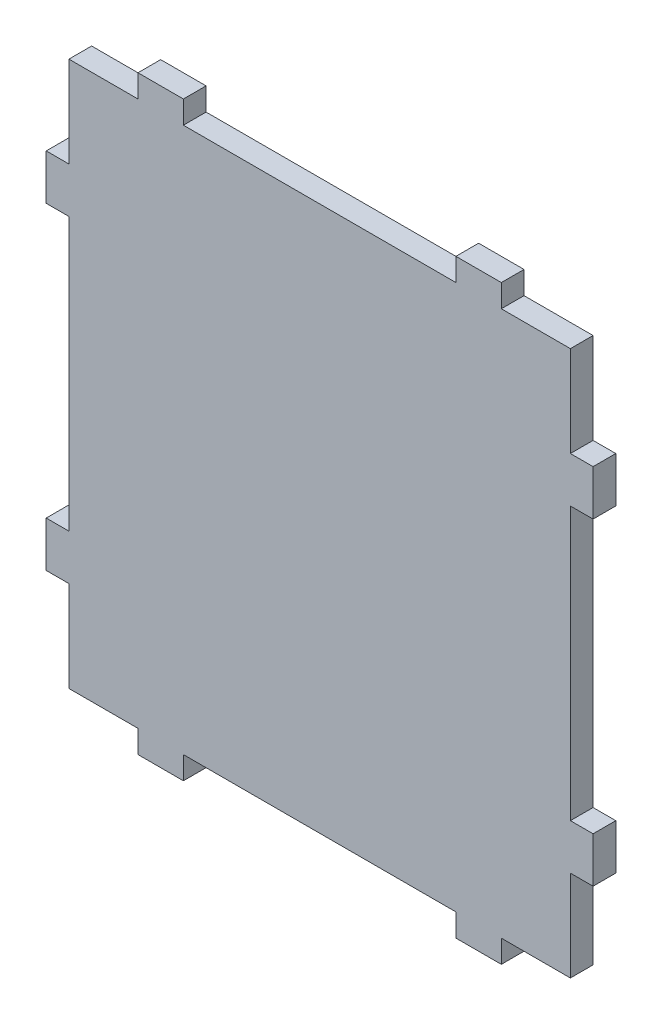
ISO-10303-21;
HEADER;
FILE_DESCRIPTION(('STEP AP214'),'2;1');
FILE_NAME('part.step','',(''),(''),'','','');
FILE_SCHEMA(('AUTOMOTIVE_DESIGN { 1 0 10303 214 1 1 1 1 }'));
ENDSEC;
DATA;
#1=APPLICATION_CONTEXT('core data for automotive mechanical design processes');
#2=APPLICATION_PROTOCOL_DEFINITION('international standard','automotive_design',2000,#1);
#3=PRODUCT_CONTEXT('',#1,'mechanical');
#4=PRODUCT('Part','Part','',(#3));
#5=PRODUCT_RELATED_PRODUCT_CATEGORY('part','',(#4));
#6=PRODUCT_DEFINITION_FORMATION('','',#4);
#7=PRODUCT_DEFINITION_CONTEXT('part definition',#1,'design');
#8=PRODUCT_DEFINITION('design','',#6,#7);
#9=PRODUCT_DEFINITION_SHAPE('','',#8);
#10=(LENGTH_UNIT() NAMED_UNIT(*) SI_UNIT(.MILLI.,.METRE.));
#11=(NAMED_UNIT(*) PLANE_ANGLE_UNIT() SI_UNIT($,.RADIAN.));
#12=(NAMED_UNIT(*) SI_UNIT($,.STERADIAN.) SOLID_ANGLE_UNIT());
#13=UNCERTAINTY_MEASURE_WITH_UNIT(LENGTH_MEASURE(1.E-05),#10,'distance_accuracy_value','');
#14=(GEOMETRIC_REPRESENTATION_CONTEXT(3) GLOBAL_UNCERTAINTY_ASSIGNED_CONTEXT((#13)) GLOBAL_UNIT_ASSIGNED_CONTEXT((#10,
#11,#12)) REPRESENTATION_CONTEXT('',''));
#15=CARTESIAN_POINT('',(0.,0.,0.));
#16=DIRECTION('',(0.,0.,1.));
#17=DIRECTION('',(1.,0.,0.));
#18=AXIS2_PLACEMENT_3D('',#15,#16,#17);
#19=CARTESIAN_POINT('',(-3.175,0.,3.175));
#20=DIRECTION('',(-1.,0.,0.));
#21=DIRECTION('',(0.,0.,1.));
#22=AXIS2_PLACEMENT_3D('',#19,#20,#21);
#23=PLANE('',#22);
#24=DIRECTION('',(0.,1.,0.));
#25=VECTOR('',#24,1.);
#26=CARTESIAN_POINT('',(-3.175,0.,0.));
#27=LINE('',#26,#25);
#28=CARTESIAN_POINT('',(-3.175,-19.05,0.));
#29=VERTEX_POINT('',#28);
#30=CARTESIAN_POINT('',(-3.175,-12.7,0.));
#31=VERTEX_POINT('',#30);
#32=EDGE_CURVE('E297',#29,#31,#27,.T.);
#33=ORIENTED_EDGE('',*,*,#32,.F.);
#34=DIRECTION('',(0.,0.,-1.));
#35=VECTOR('',#34,1.);
#36=CARTESIAN_POINT('',(-3.175,-19.05,3.175));
#37=LINE('',#36,#35);
#38=CARTESIAN_POINT('',(-3.175,-19.05,3.175));
#39=VERTEX_POINT('',#38);
#40=EDGE_CURVE('E11',#39,#29,#37,.T.);
#41=ORIENTED_EDGE('',*,*,#40,.F.);
#42=DIRECTION('',(0.,1.,0.));
#43=VECTOR('',#42,1.);
#44=CARTESIAN_POINT('',(-3.175,0.,3.175));
#45=LINE('',#44,#43);
#46=CARTESIAN_POINT('',(-3.175,-12.7,3.175));
#47=VERTEX_POINT('',#46);
#48=EDGE_CURVE('E394',#39,#47,#45,.T.);
#49=ORIENTED_EDGE('',*,*,#48,.T.);
#50=DIRECTION('',(0.,0.,-1.));
#51=VECTOR('',#50,1.);
#52=CARTESIAN_POINT('',(-3.175,-12.7,3.175));
#53=LINE('',#52,#51);
#54=EDGE_CURVE('E169',#47,#31,#53,.T.);
#55=ORIENTED_EDGE('',*,*,#54,.T.);
#56=EDGE_LOOP('',(#33,#41,#49,#55));
#57=FACE_BOUND('',#56,.T.);
#58=ADVANCED_FACE('F35',(#57),#23,.T.);
#59=CARTESIAN_POINT('',(0.,-19.05,3.175));
#60=DIRECTION('',(0.,-1.,0.));
#61=DIRECTION('',(1.,0.,0.));
#62=AXIS2_PLACEMENT_3D('',#59,#60,#61);
#63=PLANE('',#62);
#64=DIRECTION('',(-1.,0.,0.));
#65=VECTOR('',#64,1.);
#66=CARTESIAN_POINT('',(0.,-19.05,0.));
#67=LINE('',#66,#65);
#68=CARTESIAN_POINT('',(0.,-19.05,0.));
#69=VERTEX_POINT('',#68);
#70=EDGE_CURVE('E300',#69,#29,#67,.T.);
#71=ORIENTED_EDGE('',*,*,#70,.F.);
#72=DIRECTION('',(0.,0.,-1.));
#73=VECTOR('',#72,1.);
#74=CARTESIAN_POINT('',(0.,-19.05,3.175));
#75=LINE('',#74,#73);
#76=CARTESIAN_POINT('',(0.,-19.05,3.175));
#77=VERTEX_POINT('',#76);
#78=EDGE_CURVE('E43',#77,#69,#75,.T.);
#79=ORIENTED_EDGE('',*,*,#78,.F.);
#80=DIRECTION('',(-1.,0.,0.));
#81=VECTOR('',#80,1.);
#82=CARTESIAN_POINT('',(0.,-19.05,3.175));
#83=LINE('',#82,#81);
#84=EDGE_CURVE('E477',#77,#39,#83,.T.);
#85=ORIENTED_EDGE('',*,*,#84,.T.);
#86=ORIENTED_EDGE('',*,*,#40,.T.);
#87=EDGE_LOOP('',(#71,#79,#85,#86));
#88=FACE_BOUND('',#87,.T.);
#89=ADVANCED_FACE('F476',(#88),#63,.T.);
#90=CARTESIAN_POINT('',(0.,0.,3.175));
#91=DIRECTION('',(1.,0.,0.));
#92=DIRECTION('',(0.,1.,0.));
#93=AXIS2_PLACEMENT_3D('',#90,#91,#92);
#94=PLANE('',#93);
#95=DIRECTION('',(0.,-1.,0.));
#96=VECTOR('',#95,1.);
#97=CARTESIAN_POINT('',(0.,0.,0.));
#98=LINE('',#97,#96);
#99=CARTESIAN_POINT('',(0.,-57.15,0.));
#100=VERTEX_POINT('',#99);
#101=EDGE_CURVE('E303',#69,#100,#98,.T.);
#102=ORIENTED_EDGE('',*,*,#101,.T.);
#103=DIRECTION('',(0.,0.,-1.));
#104=VECTOR('',#103,1.);
#105=CARTESIAN_POINT('',(0.,-57.15,3.175));
#106=LINE('',#105,#104);
#107=CARTESIAN_POINT('',(0.,-57.15,3.175));
#108=VERTEX_POINT('',#107);
#109=EDGE_CURVE('E461',#108,#100,#106,.T.);
#110=ORIENTED_EDGE('',*,*,#109,.F.);
#111=DIRECTION('',(0.,-1.,0.));
#112=VECTOR('',#111,1.);
#113=CARTESIAN_POINT('',(0.,0.,3.175));
#114=LINE('',#113,#112);
#115=EDGE_CURVE('E468',#77,#108,#114,.T.);
#116=ORIENTED_EDGE('',*,*,#115,.F.);
#117=ORIENTED_EDGE('',*,*,#78,.T.);
#118=EDGE_LOOP('',(#102,#110,#116,#117));
#119=FACE_BOUND('',#118,.T.);
#120=ADVANCED_FACE('F466',(#119),#94,.F.);
#121=CARTESIAN_POINT('',(2.49800180540661E-13,-57.15,3.175));
#122=DIRECTION('',(0.,-1.,0.));
#123=DIRECTION('',(1.,0.,0.));
#124=AXIS2_PLACEMENT_3D('',#121,#122,#123);
#125=PLANE('',#124);
#126=DIRECTION('',(-1.,0.,0.));
#127=VECTOR('',#126,1.);
#128=CARTESIAN_POINT('',(2.49800180540661E-13,-57.15,0.));
#129=LINE('',#128,#127);
#130=CARTESIAN_POINT('',(-3.17499999999999,-57.15,0.));
#131=VERTEX_POINT('',#130);
#132=EDGE_CURVE('E305',#100,#131,#129,.T.);
#133=ORIENTED_EDGE('',*,*,#132,.T.);
#134=DIRECTION('',(0.,0.,-1.));
#135=VECTOR('',#134,1.);
#136=CARTESIAN_POINT('',(-3.17499999999999,-57.15,3.175));
#137=LINE('',#136,#135);
#138=CARTESIAN_POINT('',(-3.17499999999999,-57.15,3.175));
#139=VERTEX_POINT('',#138);
#140=EDGE_CURVE('E459',#139,#131,#137,.T.);
#141=ORIENTED_EDGE('',*,*,#140,.F.);
#142=DIRECTION('',(-1.,0.,0.));
#143=VECTOR('',#142,1.);
#144=CARTESIAN_POINT('',(2.49800180540661E-13,-57.15,3.175));
#145=LINE('',#144,#143);
#146=EDGE_CURVE('E485',#108,#139,#145,.T.);
#147=ORIENTED_EDGE('',*,*,#146,.F.);
#148=ORIENTED_EDGE('',*,*,#109,.T.);
#149=EDGE_LOOP('',(#133,#141,#147,#148));
#150=FACE_BOUND('',#149,.T.);
#151=ADVANCED_FACE('F681',(#150),#125,.F.);
#152=CARTESIAN_POINT('',(-3.17499999999999,0.,3.175));
#153=DIRECTION('',(-1.,0.,0.));
#154=DIRECTION('',(0.,0.,1.));
#155=AXIS2_PLACEMENT_3D('',#152,#153,#154);
#156=PLANE('',#155);
#157=DIRECTION('',(0.,1.,0.));
#158=VECTOR('',#157,1.);
#159=CARTESIAN_POINT('',(-3.17499999999999,0.,0.));
#160=LINE('',#159,#158);
#161=CARTESIAN_POINT('',(-3.17499999999999,-63.5,0.));
#162=VERTEX_POINT('',#161);
#163=EDGE_CURVE('E308',#162,#131,#160,.T.);
#164=ORIENTED_EDGE('',*,*,#163,.F.);
#165=DIRECTION('',(0.,0.,-1.));
#166=VECTOR('',#165,1.);
#167=CARTESIAN_POINT('',(-3.17499999999999,-63.5,3.175));
#168=LINE('',#167,#166);
#169=CARTESIAN_POINT('',(-3.17499999999999,-63.5,3.175));
#170=VERTEX_POINT('',#169);
#171=EDGE_CURVE('E457',#170,#162,#168,.T.);
#172=ORIENTED_EDGE('',*,*,#171,.F.);
#173=DIRECTION('',(0.,1.,0.));
#174=VECTOR('',#173,1.);
#175=CARTESIAN_POINT('',(-3.17499999999999,0.,3.175));
#176=LINE('',#175,#174);
#177=EDGE_CURVE('E487',#170,#139,#176,.T.);
#178=ORIENTED_EDGE('',*,*,#177,.T.);
#179=ORIENTED_EDGE('',*,*,#140,.T.);
#180=EDGE_LOOP('',(#164,#172,#178,#179));
#181=FACE_BOUND('',#180,.T.);
#182=ADVANCED_FACE('F677',(#181),#156,.T.);
#183=CARTESIAN_POINT('',(2.77555756156289E-13,-63.5,3.175));
#184=DIRECTION('',(0.,-1.,0.));
#185=DIRECTION('',(1.,0.,0.));
#186=AXIS2_PLACEMENT_3D('',#183,#184,#185);
#187=PLANE('',#186);
#188=DIRECTION('',(-1.,0.,0.));
#189=VECTOR('',#188,1.);
#190=CARTESIAN_POINT('',(2.77555756156289E-13,-63.5,0.));
#191=LINE('',#190,#189);
#192=CARTESIAN_POINT('',(0.,-63.5,0.));
#193=VERTEX_POINT('',#192);
#194=EDGE_CURVE('E311',#193,#162,#191,.T.);
#195=ORIENTED_EDGE('',*,*,#194,.F.);
#196=DIRECTION('',(0.,0.,-1.));
#197=VECTOR('',#196,1.);
#198=CARTESIAN_POINT('',(0.,-63.5,3.175));
#199=LINE('',#198,#197);
#200=CARTESIAN_POINT('',(0.,-63.5,3.175));
#201=VERTEX_POINT('',#200);
#202=EDGE_CURVE('E455',#201,#193,#199,.T.);
#203=ORIENTED_EDGE('',*,*,#202,.F.);
#204=DIRECTION('',(-1.,0.,0.));
#205=VECTOR('',#204,1.);
#206=CARTESIAN_POINT('',(2.77555756156289E-13,-63.5,3.175));
#207=LINE('',#206,#205);
#208=EDGE_CURVE('E490',#201,#170,#207,.T.);
#209=ORIENTED_EDGE('',*,*,#208,.T.);
#210=ORIENTED_EDGE('',*,*,#171,.T.);
#211=EDGE_LOOP('',(#195,#203,#209,#210));
#212=FACE_BOUND('',#211,.T.);
#213=ADVANCED_FACE('F671',(#212),#187,.T.);
#214=CARTESIAN_POINT('',(0.,0.,3.175));
#215=DIRECTION('',(1.,0.,0.));
#216=DIRECTION('',(0.,1.,0.));
#217=AXIS2_PLACEMENT_3D('',#214,#215,#216);
#218=PLANE('',#217);
#219=DIRECTION('',(0.,-1.,0.));
#220=VECTOR('',#219,1.);
#221=CARTESIAN_POINT('',(0.,0.,0.));
#222=LINE('',#221,#220);
#223=CARTESIAN_POINT('',(0.,-76.2,0.));
#224=VERTEX_POINT('',#223);
#225=EDGE_CURVE('E314',#193,#224,#222,.T.);
#226=ORIENTED_EDGE('',*,*,#225,.T.);
#227=DIRECTION('',(0.,0.,-1.));
#228=VECTOR('',#227,1.);
#229=CARTESIAN_POINT('',(0.,-76.2,3.175));
#230=LINE('',#229,#228);
#231=CARTESIAN_POINT('',(0.,-76.2,3.175));
#232=VERTEX_POINT('',#231);
#233=EDGE_CURVE('E452',#232,#224,#230,.T.);
#234=ORIENTED_EDGE('',*,*,#233,.F.);
#235=DIRECTION('',(0.,-1.,0.));
#236=VECTOR('',#235,1.);
#237=CARTESIAN_POINT('',(0.,0.,3.175));
#238=LINE('',#237,#236);
#239=EDGE_CURVE('E493',#201,#232,#238,.T.);
#240=ORIENTED_EDGE('',*,*,#239,.F.);
#241=ORIENTED_EDGE('',*,*,#202,.T.);
#242=EDGE_LOOP('',(#226,#234,#240,#241));
#243=FACE_BOUND('',#242,.T.);
#244=ADVANCED_FACE('F682',(#243),#218,.F.);
#245=CARTESIAN_POINT('',(0.,-76.2,3.175));
#246=DIRECTION('',(0.,1.,0.));
#247=DIRECTION('',(0.,0.,1.));
#248=AXIS2_PLACEMENT_3D('',#245,#246,#247);
#249=PLANE('',#248);
#250=DIRECTION('',(1.,0.,0.));
#251=VECTOR('',#250,1.);
#252=CARTESIAN_POINT('',(0.,-76.2,0.));
#253=LINE('',#252,#251);
#254=CARTESIAN_POINT('',(9.65200000000001,-76.2,0.));
#255=VERTEX_POINT('',#254);
#256=EDGE_CURVE('E316',#224,#255,#253,.T.);
#257=ORIENTED_EDGE('',*,*,#256,.T.);
#258=DIRECTION('',(0.,0.,-1.));
#259=VECTOR('',#258,1.);
#260=CARTESIAN_POINT('',(9.65200000000001,-76.2,3.175));
#261=LINE('',#260,#259);
#262=CARTESIAN_POINT('',(9.65200000000001,-76.2,3.175));
#263=VERTEX_POINT('',#262);
#264=EDGE_CURVE('E449',#263,#255,#261,.T.);
#265=ORIENTED_EDGE('',*,*,#264,.F.);
#266=DIRECTION('',(1.,0.,0.));
#267=VECTOR('',#266,1.);
#268=CARTESIAN_POINT('',(0.,-76.2,3.175));
#269=LINE('',#268,#267);
#270=EDGE_CURVE('E495',#232,#263,#269,.T.);
#271=ORIENTED_EDGE('',*,*,#270,.F.);
#272=ORIENTED_EDGE('',*,*,#233,.T.);
#273=EDGE_LOOP('',(#257,#265,#271,#272));
#274=FACE_BOUND('',#273,.T.);
#275=ADVANCED_FACE('F665',(#274),#249,.F.);
#276=CARTESIAN_POINT('',(9.65199999999992,0.,3.175));
#277=DIRECTION('',(1.,0.,0.));
#278=DIRECTION('',(0.,1.,0.));
#279=AXIS2_PLACEMENT_3D('',#276,#277,#278);
#280=PLANE('',#279);
#281=DIRECTION('',(0.,-1.,0.));
#282=VECTOR('',#281,1.);
#283=CARTESIAN_POINT('',(9.65199999999992,0.,0.));
#284=LINE('',#283,#282);
#285=CARTESIAN_POINT('',(9.65200000000001,-79.375,0.));
#286=VERTEX_POINT('',#285);
#287=EDGE_CURVE('E318',#255,#286,#284,.T.);
#288=ORIENTED_EDGE('',*,*,#287,.T.);
#289=DIRECTION('',(0.,0.,-1.));
#290=VECTOR('',#289,1.);
#291=CARTESIAN_POINT('',(9.65200000000001,-79.375,3.175));
#292=LINE('',#291,#290);
#293=CARTESIAN_POINT('',(9.65200000000001,-79.375,3.175));
#294=VERTEX_POINT('',#293);
#295=EDGE_CURVE('E446',#294,#286,#292,.T.);
#296=ORIENTED_EDGE('',*,*,#295,.F.);
#297=DIRECTION('',(0.,-1.,0.));
#298=VECTOR('',#297,1.);
#299=CARTESIAN_POINT('',(9.65199999999992,0.,3.175));
#300=LINE('',#299,#298);
#301=EDGE_CURVE('E497',#263,#294,#300,.T.);
#302=ORIENTED_EDGE('',*,*,#301,.F.);
#303=ORIENTED_EDGE('',*,*,#264,.T.);
#304=EDGE_LOOP('',(#288,#296,#302,#303));
#305=FACE_BOUND('',#304,.T.);
#306=ADVANCED_FACE('F661',(#305),#280,.F.);
#307=CARTESIAN_POINT('',(0.,-79.375,3.175));
#308=DIRECTION('',(0.,1.,0.));
#309=DIRECTION('',(0.,0.,1.));
#310=AXIS2_PLACEMENT_3D('',#307,#308,#309);
#311=PLANE('',#310);
#312=DIRECTION('',(1.,0.,0.));
#313=VECTOR('',#312,1.);
#314=CARTESIAN_POINT('',(0.,-79.375,0.));
#315=LINE('',#314,#313);
#316=CARTESIAN_POINT('',(16.002,-79.375,0.));
#317=VERTEX_POINT('',#316);
#318=EDGE_CURVE('E320',#286,#317,#315,.T.);
#319=ORIENTED_EDGE('',*,*,#318,.T.);
#320=DIRECTION('',(0.,0.,-1.));
#321=VECTOR('',#320,1.);
#322=CARTESIAN_POINT('',(16.002,-79.375,3.175));
#323=LINE('',#322,#321);
#324=CARTESIAN_POINT('',(16.002,-79.375,3.175));
#325=VERTEX_POINT('',#324);
#326=EDGE_CURVE('E444',#325,#317,#323,.T.);
#327=ORIENTED_EDGE('',*,*,#326,.F.);
#328=DIRECTION('',(1.,0.,0.));
#329=VECTOR('',#328,1.);
#330=CARTESIAN_POINT('',(0.,-79.375,3.175));
#331=LINE('',#330,#329);
#332=EDGE_CURVE('E499',#294,#325,#331,.T.);
#333=ORIENTED_EDGE('',*,*,#332,.F.);
#334=ORIENTED_EDGE('',*,*,#295,.T.);
#335=EDGE_LOOP('',(#319,#327,#333,#334));
#336=FACE_BOUND('',#335,.T.);
#337=ADVANCED_FACE('F656',(#336),#311,.F.);
#338=CARTESIAN_POINT('',(16.0019999999998,0.,3.175));
#339=DIRECTION('',(1.,0.,0.));
#340=DIRECTION('',(0.,1.,0.));
#341=AXIS2_PLACEMENT_3D('',#338,#339,#340);
#342=PLANE('',#341);
#343=DIRECTION('',(0.,-1.,0.));
#344=VECTOR('',#343,1.);
#345=CARTESIAN_POINT('',(16.0019999999998,0.,0.));
#346=LINE('',#345,#344);
#347=CARTESIAN_POINT('',(16.002,-76.2,0.));
#348=VERTEX_POINT('',#347);
#349=EDGE_CURVE('E323',#348,#317,#346,.T.);
#350=ORIENTED_EDGE('',*,*,#349,.F.);
#351=DIRECTION('',(0.,0.,-1.));
#352=VECTOR('',#351,1.);
#353=CARTESIAN_POINT('',(16.002,-76.2,3.175));
#354=LINE('',#353,#352);
#355=CARTESIAN_POINT('',(16.002,-76.2,3.175));
#356=VERTEX_POINT('',#355);
#357=EDGE_CURVE('E442',#356,#348,#354,.T.);
#358=ORIENTED_EDGE('',*,*,#357,.F.);
#359=DIRECTION('',(0.,-1.,0.));
#360=VECTOR('',#359,1.);
#361=CARTESIAN_POINT('',(16.0019999999998,0.,3.175));
#362=LINE('',#361,#360);
#363=EDGE_CURVE('E501',#356,#325,#362,.T.);
#364=ORIENTED_EDGE('',*,*,#363,.T.);
#365=ORIENTED_EDGE('',*,*,#326,.T.);
#366=EDGE_LOOP('',(#350,#358,#364,#365));
#367=FACE_BOUND('',#366,.T.);
#368=ADVANCED_FACE('F650',(#367),#342,.T.);
#369=CARTESIAN_POINT('',(0.,-76.2,3.175));
#370=DIRECTION('',(0.,1.,0.));
#371=DIRECTION('',(0.,0.,1.));
#372=AXIS2_PLACEMENT_3D('',#369,#370,#371);
#373=PLANE('',#372);
#374=DIRECTION('',(1.,0.,0.));
#375=VECTOR('',#374,1.);
#376=CARTESIAN_POINT('',(0.,-76.2,0.));
#377=LINE('',#376,#375);
#378=CARTESIAN_POINT('',(54.102,-76.2,0.));
#379=VERTEX_POINT('',#378);
#380=EDGE_CURVE('E326',#348,#379,#377,.T.);
#381=ORIENTED_EDGE('',*,*,#380,.T.);
#382=DIRECTION('',(0.,0.,-1.));
#383=VECTOR('',#382,1.);
#384=CARTESIAN_POINT('',(54.102,-76.2,3.175));
#385=LINE('',#384,#383);
#386=CARTESIAN_POINT('',(54.102,-76.2,3.175));
#387=VERTEX_POINT('',#386);
#388=EDGE_CURVE('E439',#387,#379,#385,.T.);
#389=ORIENTED_EDGE('',*,*,#388,.F.);
#390=DIRECTION('',(1.,0.,0.));
#391=VECTOR('',#390,1.);
#392=CARTESIAN_POINT('',(0.,-76.2,3.175));
#393=LINE('',#392,#391);
#394=EDGE_CURVE('E504',#356,#387,#393,.T.);
#395=ORIENTED_EDGE('',*,*,#394,.F.);
#396=ORIENTED_EDGE('',*,*,#357,.T.);
#397=EDGE_LOOP('',(#381,#389,#395,#396));
#398=FACE_BOUND('',#397,.T.);
#399=ADVANCED_FACE('F647',(#398),#373,.F.);
#400=CARTESIAN_POINT('',(54.102,0.,3.175));
#401=DIRECTION('',(1.,0.,0.));
#402=DIRECTION('',(0.,0.,-1.));
#403=AXIS2_PLACEMENT_3D('',#400,#401,#402);
#404=PLANE('',#403);
#405=DIRECTION('',(0.,-1.,0.));
#406=VECTOR('',#405,1.);
#407=CARTESIAN_POINT('',(54.102,0.,0.));
#408=LINE('',#407,#406);
#409=CARTESIAN_POINT('',(54.102,-79.375,0.));
#410=VERTEX_POINT('',#409);
#411=EDGE_CURVE('E328',#379,#410,#408,.T.);
#412=ORIENTED_EDGE('',*,*,#411,.T.);
#413=DIRECTION('',(0.,0.,-1.));
#414=VECTOR('',#413,1.);
#415=CARTESIAN_POINT('',(54.102,-79.375,3.175));
#416=LINE('',#415,#414);
#417=CARTESIAN_POINT('',(54.102,-79.375,3.175));
#418=VERTEX_POINT('',#417);
#419=EDGE_CURVE('E436',#418,#410,#416,.T.);
#420=ORIENTED_EDGE('',*,*,#419,.F.);
#421=DIRECTION('',(0.,-1.,0.));
#422=VECTOR('',#421,1.);
#423=CARTESIAN_POINT('',(54.102,0.,3.175));
#424=LINE('',#423,#422);
#425=EDGE_CURVE('E506',#387,#418,#424,.T.);
#426=ORIENTED_EDGE('',*,*,#425,.F.);
#427=ORIENTED_EDGE('',*,*,#388,.T.);
#428=EDGE_LOOP('',(#412,#420,#426,#427));
#429=FACE_BOUND('',#428,.T.);
#430=ADVANCED_FACE('F642',(#429),#404,.F.);
#431=CARTESIAN_POINT('',(0.,-79.375,3.175));
#432=DIRECTION('',(0.,1.,0.));
#433=DIRECTION('',(0.,0.,1.));
#434=AXIS2_PLACEMENT_3D('',#431,#432,#433);
#435=PLANE('',#434);
#436=DIRECTION('',(1.,0.,0.));
#437=VECTOR('',#436,1.);
#438=CARTESIAN_POINT('',(0.,-79.375,0.));
#439=LINE('',#438,#437);
#440=CARTESIAN_POINT('',(60.452,-79.375,0.));
#441=VERTEX_POINT('',#440);
#442=EDGE_CURVE('E330',#410,#441,#439,.T.);
#443=ORIENTED_EDGE('',*,*,#442,.T.);
#444=DIRECTION('',(0.,0.,-1.));
#445=VECTOR('',#444,1.);
#446=CARTESIAN_POINT('',(60.452,-79.375,3.175));
#447=LINE('',#446,#445);
#448=CARTESIAN_POINT('',(60.452,-79.375,3.175));
#449=VERTEX_POINT('',#448);
#450=EDGE_CURVE('E434',#449,#441,#447,.T.);
#451=ORIENTED_EDGE('',*,*,#450,.F.);
#452=DIRECTION('',(1.,0.,0.));
#453=VECTOR('',#452,1.);
#454=CARTESIAN_POINT('',(0.,-79.375,3.175));
#455=LINE('',#454,#453);
#456=EDGE_CURVE('E508',#418,#449,#455,.T.);
#457=ORIENTED_EDGE('',*,*,#456,.F.);
#458=ORIENTED_EDGE('',*,*,#419,.T.);
#459=EDGE_LOOP('',(#443,#451,#457,#458));
#460=FACE_BOUND('',#459,.T.);
#461=ADVANCED_FACE('F636',(#460),#435,.F.);
#462=CARTESIAN_POINT('',(60.452,0.,3.175));
#463=DIRECTION('',(1.,0.,0.));
#464=DIRECTION('',(0.,0.,-1.));
#465=AXIS2_PLACEMENT_3D('',#462,#463,#464);
#466=PLANE('',#465);
#467=DIRECTION('',(0.,-1.,0.));
#468=VECTOR('',#467,1.);
#469=CARTESIAN_POINT('',(60.452,0.,0.));
#470=LINE('',#469,#468);
#471=CARTESIAN_POINT('',(60.452,-76.2,0.));
#472=VERTEX_POINT('',#471);
#473=EDGE_CURVE('E333',#472,#441,#470,.T.);
#474=ORIENTED_EDGE('',*,*,#473,.F.);
#475=DIRECTION('',(0.,0.,-1.));
#476=VECTOR('',#475,1.);
#477=CARTESIAN_POINT('',(60.452,-76.2,3.175));
#478=LINE('',#477,#476);
#479=CARTESIAN_POINT('',(60.452,-76.2,3.175));
#480=VERTEX_POINT('',#479);
#481=EDGE_CURVE('E432',#480,#472,#478,.T.);
#482=ORIENTED_EDGE('',*,*,#481,.F.);
#483=DIRECTION('',(0.,-1.,0.));
#484=VECTOR('',#483,1.);
#485=CARTESIAN_POINT('',(60.452,0.,3.175));
#486=LINE('',#485,#484);
#487=EDGE_CURVE('E510',#480,#449,#486,.T.);
#488=ORIENTED_EDGE('',*,*,#487,.T.);
#489=ORIENTED_EDGE('',*,*,#450,.T.);
#490=EDGE_LOOP('',(#474,#482,#488,#489));
#491=FACE_BOUND('',#490,.T.);
#492=ADVANCED_FACE('F630',(#491),#466,.T.);
#493=CARTESIAN_POINT('',(0.,-76.2,3.175));
#494=DIRECTION('',(0.,1.,0.));
#495=DIRECTION('',(0.,0.,1.));
#496=AXIS2_PLACEMENT_3D('',#493,#494,#495);
#497=PLANE('',#496);
#498=DIRECTION('',(1.,0.,0.));
#499=VECTOR('',#498,1.);
#500=CARTESIAN_POINT('',(0.,-76.2,0.));
#501=LINE('',#500,#499);
#502=CARTESIAN_POINT('',(70.104,-76.2,0.));
#503=VERTEX_POINT('',#502);
#504=EDGE_CURVE('E336',#472,#503,#501,.T.);
#505=ORIENTED_EDGE('',*,*,#504,.T.);
#506=DIRECTION('',(0.,0.,-1.));
#507=VECTOR('',#506,1.);
#508=CARTESIAN_POINT('',(70.104,-76.2,3.175));
#509=LINE('',#508,#507);
#510=CARTESIAN_POINT('',(70.104,-76.2,3.175));
#511=VERTEX_POINT('',#510);
#512=EDGE_CURVE('E430',#511,#503,#509,.T.);
#513=ORIENTED_EDGE('',*,*,#512,.F.);
#514=DIRECTION('',(1.,0.,0.));
#515=VECTOR('',#514,1.);
#516=CARTESIAN_POINT('',(0.,-76.2,3.175));
#517=LINE('',#516,#515);
#518=EDGE_CURVE('E513',#480,#511,#517,.T.);
#519=ORIENTED_EDGE('',*,*,#518,.F.);
#520=ORIENTED_EDGE('',*,*,#481,.T.);
#521=EDGE_LOOP('',(#505,#513,#519,#520));
#522=FACE_BOUND('',#521,.T.);
#523=ADVANCED_FACE('F778',(#522),#497,.F.);
#524=CARTESIAN_POINT('',(70.104,0.,3.175));
#525=DIRECTION('',(1.,0.,0.));
#526=DIRECTION('',(0.,0.,-1.));
#527=AXIS2_PLACEMENT_3D('',#524,#525,#526);
#528=PLANE('',#527);
#529=DIRECTION('',(0.,-1.,0.));
#530=VECTOR('',#529,1.);
#531=CARTESIAN_POINT('',(70.104,0.,0.));
#532=LINE('',#531,#530);
#533=CARTESIAN_POINT('',(70.104,-63.5,0.));
#534=VERTEX_POINT('',#533);
#535=EDGE_CURVE('E339',#534,#503,#532,.T.);
#536=ORIENTED_EDGE('',*,*,#535,.F.);
#537=DIRECTION('',(0.,0.,-1.));
#538=VECTOR('',#537,1.);
#539=CARTESIAN_POINT('',(70.104,-63.5,3.175));
#540=LINE('',#539,#538);
#541=CARTESIAN_POINT('',(70.104,-63.5,3.175));
#542=VERTEX_POINT('',#541);
#543=EDGE_CURVE('E428',#542,#534,#540,.T.);
#544=ORIENTED_EDGE('',*,*,#543,.F.);
#545=DIRECTION('',(0.,-1.,0.));
#546=VECTOR('',#545,1.);
#547=CARTESIAN_POINT('',(70.104,0.,3.175));
#548=LINE('',#547,#546);
#549=EDGE_CURVE('E515',#542,#511,#548,.T.);
#550=ORIENTED_EDGE('',*,*,#549,.T.);
#551=ORIENTED_EDGE('',*,*,#512,.T.);
#552=EDGE_LOOP('',(#536,#544,#550,#551));
#553=FACE_BOUND('',#552,.T.);
#554=ADVANCED_FACE('F623',(#553),#528,.T.);
#555=CARTESIAN_POINT('',(0.,-63.5,3.175));
#556=DIRECTION('',(0.,1.,0.));
#557=DIRECTION('',(0.,0.,1.));
#558=AXIS2_PLACEMENT_3D('',#555,#556,#557);
#559=PLANE('',#558);
#560=DIRECTION('',(1.,0.,0.));
#561=VECTOR('',#560,1.);
#562=CARTESIAN_POINT('',(0.,-63.5,0.));
#563=LINE('',#562,#561);
#564=CARTESIAN_POINT('',(73.279,-63.5,0.));
#565=VERTEX_POINT('',#564);
#566=EDGE_CURVE('E342',#534,#565,#563,.T.);
#567=ORIENTED_EDGE('',*,*,#566,.T.);
#568=DIRECTION('',(0.,0.,-1.));
#569=VECTOR('',#568,1.);
#570=CARTESIAN_POINT('',(73.279,-63.5,3.175));
#571=LINE('',#570,#569);
#572=CARTESIAN_POINT('',(73.279,-63.5,3.175));
#573=VERTEX_POINT('',#572);
#574=EDGE_CURVE('E426',#573,#565,#571,.T.);
#575=ORIENTED_EDGE('',*,*,#574,.F.);
#576=DIRECTION('',(1.,0.,0.));
#577=VECTOR('',#576,1.);
#578=CARTESIAN_POINT('',(0.,-63.5,3.175));
#579=LINE('',#578,#577);
#580=EDGE_CURVE('E518',#542,#573,#579,.T.);
#581=ORIENTED_EDGE('',*,*,#580,.F.);
#582=ORIENTED_EDGE('',*,*,#543,.T.);
#583=EDGE_LOOP('',(#567,#575,#581,#582));
#584=FACE_BOUND('',#583,.T.);
#585=ADVANCED_FACE('F620',(#584),#559,.F.);
#586=CARTESIAN_POINT('',(73.2790000000001,-1.60149671302179E-13,3.175));
#587=DIRECTION('',(1.,0.,0.));
#588=DIRECTION('',(0.,1.,0.));
#589=AXIS2_PLACEMENT_3D('',#586,#587,#588);
#590=PLANE('',#589);
#591=DIRECTION('',(0.,-1.,0.));
#592=VECTOR('',#591,1.);
#593=CARTESIAN_POINT('',(73.2790000000001,-1.60149671302179E-13,0.));
#594=LINE('',#593,#592);
#595=CARTESIAN_POINT('',(73.279,-57.15,0.));
#596=VERTEX_POINT('',#595);
#597=EDGE_CURVE('E345',#596,#565,#594,.T.);
#598=ORIENTED_EDGE('',*,*,#597,.F.);
#599=DIRECTION('',(0.,0.,-1.));
#600=VECTOR('',#599,1.);
#601=CARTESIAN_POINT('',(73.279,-57.15,3.175));
#602=LINE('',#601,#600);
#603=CARTESIAN_POINT('',(73.279,-57.15,3.175));
#604=VERTEX_POINT('',#603);
#605=EDGE_CURVE('E424',#604,#596,#602,.T.);
#606=ORIENTED_EDGE('',*,*,#605,.F.);
#607=DIRECTION('',(0.,-1.,0.));
#608=VECTOR('',#607,1.);
#609=CARTESIAN_POINT('',(73.2790000000001,-1.60149671302179E-13,3.175));
#610=LINE('',#609,#608);
#611=EDGE_CURVE('E520',#604,#573,#610,.T.);
#612=ORIENTED_EDGE('',*,*,#611,.T.);
#613=ORIENTED_EDGE('',*,*,#574,.T.);
#614=EDGE_LOOP('',(#598,#606,#612,#613));
#615=FACE_BOUND('',#614,.T.);
#616=ADVANCED_FACE('F615',(#615),#590,.T.);
#617=CARTESIAN_POINT('',(0.,-57.15,3.175));
#618=DIRECTION('',(0.,1.,0.));
#619=DIRECTION('',(0.,0.,1.));
#620=AXIS2_PLACEMENT_3D('',#617,#618,#619);
#621=PLANE('',#620);
#622=DIRECTION('',(1.,0.,0.));
#623=VECTOR('',#622,1.);
#624=CARTESIAN_POINT('',(0.,-57.15,0.));
#625=LINE('',#624,#623);
#626=CARTESIAN_POINT('',(70.104,-57.15,0.));
#627=VERTEX_POINT('',#626);
#628=EDGE_CURVE('E348',#627,#596,#625,.T.);
#629=ORIENTED_EDGE('',*,*,#628,.F.);
#630=DIRECTION('',(0.,0.,-1.));
#631=VECTOR('',#630,1.);
#632=CARTESIAN_POINT('',(70.104,-57.15,3.175));
#633=LINE('',#632,#631);
#634=CARTESIAN_POINT('',(70.104,-57.15,3.175));
#635=VERTEX_POINT('',#634);
#636=EDGE_CURVE('E422',#635,#627,#633,.T.);
#637=ORIENTED_EDGE('',*,*,#636,.F.);
#638=DIRECTION('',(1.,0.,0.));
#639=VECTOR('',#638,1.);
#640=CARTESIAN_POINT('',(0.,-57.15,3.175));
#641=LINE('',#640,#639);
#642=EDGE_CURVE('E523',#635,#604,#641,.T.);
#643=ORIENTED_EDGE('',*,*,#642,.T.);
#644=ORIENTED_EDGE('',*,*,#605,.T.);
#645=EDGE_LOOP('',(#629,#637,#643,#644));
#646=FACE_BOUND('',#645,.T.);
#647=ADVANCED_FACE('F610',(#646),#621,.T.);
#648=CARTESIAN_POINT('',(70.104,0.,3.175));
#649=DIRECTION('',(1.,0.,0.));
#650=DIRECTION('',(0.,0.,-1.));
#651=AXIS2_PLACEMENT_3D('',#648,#649,#650);
#652=PLANE('',#651);
#653=DIRECTION('',(0.,-1.,0.));
#654=VECTOR('',#653,1.);
#655=CARTESIAN_POINT('',(70.104,0.,0.));
#656=LINE('',#655,#654);
#657=CARTESIAN_POINT('',(70.104,-19.05,0.));
#658=VERTEX_POINT('',#657);
#659=EDGE_CURVE('E351',#658,#627,#656,.T.);
#660=ORIENTED_EDGE('',*,*,#659,.F.);
#661=DIRECTION('',(0.,0.,-1.));
#662=VECTOR('',#661,1.);
#663=CARTESIAN_POINT('',(70.104,-19.05,3.175));
#664=LINE('',#663,#662);
#665=CARTESIAN_POINT('',(70.104,-19.05,3.175));
#666=VERTEX_POINT('',#665);
#667=EDGE_CURVE('E420',#666,#658,#664,.T.);
#668=ORIENTED_EDGE('',*,*,#667,.F.);
#669=DIRECTION('',(0.,-1.,0.));
#670=VECTOR('',#669,1.);
#671=CARTESIAN_POINT('',(70.104,0.,3.175));
#672=LINE('',#671,#670);
#673=EDGE_CURVE('E526',#666,#635,#672,.T.);
#674=ORIENTED_EDGE('',*,*,#673,.T.);
#675=ORIENTED_EDGE('',*,*,#636,.T.);
#676=EDGE_LOOP('',(#660,#668,#674,#675));
#677=FACE_BOUND('',#676,.T.);
#678=ADVANCED_FACE('F604',(#677),#652,.T.);
#679=CARTESIAN_POINT('',(0.,-19.0500000000001,3.175));
#680=DIRECTION('',(0.,1.,0.));
#681=DIRECTION('',(-1.,0.,0.));
#682=AXIS2_PLACEMENT_3D('',#679,#680,#681);
#683=PLANE('',#682);
#684=DIRECTION('',(1.,0.,0.));
#685=VECTOR('',#684,1.);
#686=CARTESIAN_POINT('',(0.,-19.0500000000001,0.));
#687=LINE('',#686,#685);
#688=CARTESIAN_POINT('',(73.279,-19.05,0.));
#689=VERTEX_POINT('',#688);
#690=EDGE_CURVE('E354',#658,#689,#687,.T.);
#691=ORIENTED_EDGE('',*,*,#690,.T.);
#692=DIRECTION('',(0.,0.,-1.));
#693=VECTOR('',#692,1.);
#694=CARTESIAN_POINT('',(73.279,-19.05,3.175));
#695=LINE('',#694,#693);
#696=CARTESIAN_POINT('',(73.279,-19.05,3.175));
#697=VERTEX_POINT('',#696);
#698=EDGE_CURVE('E418',#697,#689,#695,.T.);
#699=ORIENTED_EDGE('',*,*,#698,.F.);
#700=DIRECTION('',(1.,0.,0.));
#701=VECTOR('',#700,1.);
#702=CARTESIAN_POINT('',(0.,-19.0500000000001,3.175));
#703=LINE('',#702,#701);
#704=EDGE_CURVE('E529',#666,#697,#703,.T.);
#705=ORIENTED_EDGE('',*,*,#704,.F.);
#706=ORIENTED_EDGE('',*,*,#667,.T.);
#707=EDGE_LOOP('',(#691,#699,#705,#706));
#708=FACE_BOUND('',#707,.T.);
#709=ADVANCED_FACE('F827',(#708),#683,.F.);
#710=CARTESIAN_POINT('',(73.279,0.,3.175));
#711=DIRECTION('',(1.,0.,0.));
#712=DIRECTION('',(0.,0.,-1.));
#713=AXIS2_PLACEMENT_3D('',#710,#711,#712);
#714=PLANE('',#713);
#715=DIRECTION('',(0.,-1.,0.));
#716=VECTOR('',#715,1.);
#717=CARTESIAN_POINT('',(73.279,0.,0.));
#718=LINE('',#717,#716);
#719=CARTESIAN_POINT('',(73.279,-12.7,0.));
#720=VERTEX_POINT('',#719);
#721=EDGE_CURVE('E357',#720,#689,#718,.T.);
#722=ORIENTED_EDGE('',*,*,#721,.F.);
#723=DIRECTION('',(0.,0.,-1.));
#724=VECTOR('',#723,1.);
#725=CARTESIAN_POINT('',(73.279,-12.7,3.175));
#726=LINE('',#725,#724);
#727=CARTESIAN_POINT('',(73.279,-12.7,3.175));
#728=VERTEX_POINT('',#727);
#729=EDGE_CURVE('E416',#728,#720,#726,.T.);
#730=ORIENTED_EDGE('',*,*,#729,.F.);
#731=DIRECTION('',(0.,-1.,0.));
#732=VECTOR('',#731,1.);
#733=CARTESIAN_POINT('',(73.279,0.,3.175));
#734=LINE('',#733,#732);
#735=EDGE_CURVE('E531',#728,#697,#734,.T.);
#736=ORIENTED_EDGE('',*,*,#735,.T.);
#737=ORIENTED_EDGE('',*,*,#698,.T.);
#738=EDGE_LOOP('',(#722,#730,#736,#737));
#739=FACE_BOUND('',#738,.T.);
#740=ADVANCED_FACE('F598',(#739),#714,.T.);
#741=CARTESIAN_POINT('',(0.,-12.7,3.175));
#742=DIRECTION('',(0.,1.,0.));
#743=DIRECTION('',(0.,0.,1.));
#744=AXIS2_PLACEMENT_3D('',#741,#742,#743);
#745=PLANE('',#744);
#746=DIRECTION('',(1.,0.,0.));
#747=VECTOR('',#746,1.);
#748=CARTESIAN_POINT('',(0.,-12.7,0.));
#749=LINE('',#748,#747);
#750=CARTESIAN_POINT('',(70.104,-12.7,0.));
#751=VERTEX_POINT('',#750);
#752=EDGE_CURVE('E360',#751,#720,#749,.T.);
#753=ORIENTED_EDGE('',*,*,#752,.F.);
#754=DIRECTION('',(0.,0.,-1.));
#755=VECTOR('',#754,1.);
#756=CARTESIAN_POINT('',(70.104,-12.7,3.175));
#757=LINE('',#756,#755);
#758=CARTESIAN_POINT('',(70.104,-12.7,3.175));
#759=VERTEX_POINT('',#758);
#760=EDGE_CURVE('E414',#759,#751,#757,.T.);
#761=ORIENTED_EDGE('',*,*,#760,.F.);
#762=DIRECTION('',(1.,0.,0.));
#763=VECTOR('',#762,1.);
#764=CARTESIAN_POINT('',(0.,-12.7,3.175));
#765=LINE('',#764,#763);
#766=EDGE_CURVE('E534',#759,#728,#765,.T.);
#767=ORIENTED_EDGE('',*,*,#766,.T.);
#768=ORIENTED_EDGE('',*,*,#729,.T.);
#769=EDGE_LOOP('',(#753,#761,#767,#768));
#770=FACE_BOUND('',#769,.T.);
#771=ADVANCED_FACE('F594',(#770),#745,.T.);
#772=CARTESIAN_POINT('',(70.104,0.,3.175));
#773=DIRECTION('',(1.,0.,0.));
#774=DIRECTION('',(0.,0.,-1.));
#775=AXIS2_PLACEMENT_3D('',#772,#773,#774);
#776=PLANE('',#775);
#777=DIRECTION('',(0.,-1.,0.));
#778=VECTOR('',#777,1.);
#779=CARTESIAN_POINT('',(70.104,0.,0.));
#780=LINE('',#779,#778);
#781=CARTESIAN_POINT('',(70.104,0.,0.));
#782=VERTEX_POINT('',#781);
#783=EDGE_CURVE('E363',#782,#751,#780,.T.);
#784=ORIENTED_EDGE('',*,*,#783,.F.);
#785=DIRECTION('',(0.,0.,-1.));
#786=VECTOR('',#785,1.);
#787=CARTESIAN_POINT('',(70.104,0.,3.175));
#788=LINE('',#787,#786);
#789=CARTESIAN_POINT('',(70.104,0.,3.175));
#790=VERTEX_POINT('',#789);
#791=EDGE_CURVE('E412',#790,#782,#788,.T.);
#792=ORIENTED_EDGE('',*,*,#791,.F.);
#793=DIRECTION('',(0.,-1.,0.));
#794=VECTOR('',#793,1.);
#795=CARTESIAN_POINT('',(70.104,0.,3.175));
#796=LINE('',#795,#794);
#797=EDGE_CURVE('E537',#790,#759,#796,.T.);
#798=ORIENTED_EDGE('',*,*,#797,.T.);
#799=ORIENTED_EDGE('',*,*,#760,.T.);
#800=EDGE_LOOP('',(#784,#792,#798,#799));
#801=FACE_BOUND('',#800,.T.);
#802=ADVANCED_FACE('F590',(#801),#776,.T.);
#803=CARTESIAN_POINT('',(0.,0.,3.175));
#804=DIRECTION('',(0.,1.,0.));
#805=DIRECTION('',(-1.,0.,0.));
#806=AXIS2_PLACEMENT_3D('',#803,#804,#805);
#807=PLANE('',#806);
#808=DIRECTION('',(1.,0.,0.));
#809=VECTOR('',#808,1.);
#810=CARTESIAN_POINT('',(0.,0.,0.));
#811=LINE('',#810,#809);
#812=CARTESIAN_POINT('',(60.452,0.,0.));
#813=VERTEX_POINT('',#812);
#814=EDGE_CURVE('E366',#813,#782,#811,.T.);
#815=ORIENTED_EDGE('',*,*,#814,.F.);
#816=DIRECTION('',(0.,0.,-1.));
#817=VECTOR('',#816,1.);
#818=CARTESIAN_POINT('',(60.452,0.,3.175));
#819=LINE('',#818,#817);
#820=CARTESIAN_POINT('',(60.452,0.,3.175));
#821=VERTEX_POINT('',#820);
#822=EDGE_CURVE('E410',#821,#813,#819,.T.);
#823=ORIENTED_EDGE('',*,*,#822,.F.);
#824=DIRECTION('',(1.,0.,0.));
#825=VECTOR('',#824,1.);
#826=CARTESIAN_POINT('',(0.,0.,3.175));
#827=LINE('',#826,#825);
#828=EDGE_CURVE('E540',#821,#790,#827,.T.);
#829=ORIENTED_EDGE('',*,*,#828,.T.);
#830=ORIENTED_EDGE('',*,*,#791,.T.);
#831=EDGE_LOOP('',(#815,#823,#829,#830));
#832=FACE_BOUND('',#831,.T.);
#833=ADVANCED_FACE('F586',(#832),#807,.T.);
#834=CARTESIAN_POINT('',(60.452,0.,3.175));
#835=DIRECTION('',(-1.,0.,0.));
#836=DIRECTION('',(0.,0.,1.));
#837=AXIS2_PLACEMENT_3D('',#834,#835,#836);
#838=PLANE('',#837);
#839=DIRECTION('',(0.,1.,0.));
#840=VECTOR('',#839,1.);
#841=CARTESIAN_POINT('',(60.452,0.,0.));
#842=LINE('',#841,#840);
#843=CARTESIAN_POINT('',(60.452,3.175,0.));
#844=VERTEX_POINT('',#843);
#845=EDGE_CURVE('E369',#813,#844,#842,.T.);
#846=ORIENTED_EDGE('',*,*,#845,.T.);
#847=DIRECTION('',(0.,0.,-1.));
#848=VECTOR('',#847,1.);
#849=CARTESIAN_POINT('',(60.452,3.175,3.175));
#850=LINE('',#849,#848);
#851=CARTESIAN_POINT('',(60.452,3.175,3.175));
#852=VERTEX_POINT('',#851);
#853=EDGE_CURVE('E408',#852,#844,#850,.T.);
#854=ORIENTED_EDGE('',*,*,#853,.F.);
#855=DIRECTION('',(0.,1.,0.));
#856=VECTOR('',#855,1.);
#857=CARTESIAN_POINT('',(60.452,0.,3.175));
#858=LINE('',#857,#856);
#859=EDGE_CURVE('E543',#821,#852,#858,.T.);
#860=ORIENTED_EDGE('',*,*,#859,.F.);
#861=ORIENTED_EDGE('',*,*,#822,.T.);
#862=EDGE_LOOP('',(#846,#854,#860,#861));
#863=FACE_BOUND('',#862,.T.);
#864=ADVANCED_FACE('F583',(#863),#838,.F.);
#865=CARTESIAN_POINT('',(0.,3.175,3.175));
#866=DIRECTION('',(0.,1.,0.));
#867=DIRECTION('',(0.,0.,1.));
#868=AXIS2_PLACEMENT_3D('',#865,#866,#867);
#869=PLANE('',#868);
#870=DIRECTION('',(1.,0.,0.));
#871=VECTOR('',#870,1.);
#872=CARTESIAN_POINT('',(0.,3.175,0.));
#873=LINE('',#872,#871);
#874=CARTESIAN_POINT('',(54.102,3.175,0.));
#875=VERTEX_POINT('',#874);
#876=EDGE_CURVE('E372',#875,#844,#873,.T.);
#877=ORIENTED_EDGE('',*,*,#876,.F.);
#878=DIRECTION('',(0.,0.,-1.));
#879=VECTOR('',#878,1.);
#880=CARTESIAN_POINT('',(54.102,3.175,3.175));
#881=LINE('',#880,#879);
#882=CARTESIAN_POINT('',(54.102,3.175,3.175));
#883=VERTEX_POINT('',#882);
#884=EDGE_CURVE('E406',#883,#875,#881,.T.);
#885=ORIENTED_EDGE('',*,*,#884,.F.);
#886=DIRECTION('',(1.,0.,0.));
#887=VECTOR('',#886,1.);
#888=CARTESIAN_POINT('',(0.,3.175,3.175));
#889=LINE('',#888,#887);
#890=EDGE_CURVE('E545',#883,#852,#889,.T.);
#891=ORIENTED_EDGE('',*,*,#890,.T.);
#892=ORIENTED_EDGE('',*,*,#853,.T.);
#893=EDGE_LOOP('',(#877,#885,#891,#892));
#894=FACE_BOUND('',#893,.T.);
#895=ADVANCED_FACE('F578',(#894),#869,.T.);
#896=CARTESIAN_POINT('',(54.102,0.,3.175));
#897=DIRECTION('',(-1.,0.,0.));
#898=DIRECTION('',(0.,0.,1.));
#899=AXIS2_PLACEMENT_3D('',#896,#897,#898);
#900=PLANE('',#899);
#901=DIRECTION('',(0.,1.,0.));
#902=VECTOR('',#901,1.);
#903=CARTESIAN_POINT('',(54.102,0.,0.));
#904=LINE('',#903,#902);
#905=CARTESIAN_POINT('',(54.102,0.,0.));
#906=VERTEX_POINT('',#905);
#907=EDGE_CURVE('E375',#906,#875,#904,.T.);
#908=ORIENTED_EDGE('',*,*,#907,.F.);
#909=DIRECTION('',(0.,0.,-1.));
#910=VECTOR('',#909,1.);
#911=CARTESIAN_POINT('',(54.102,0.,3.175));
#912=LINE('',#911,#910);
#913=CARTESIAN_POINT('',(54.102,0.,3.175));
#914=VERTEX_POINT('',#913);
#915=EDGE_CURVE('E404',#914,#906,#912,.T.);
#916=ORIENTED_EDGE('',*,*,#915,.F.);
#917=DIRECTION('',(0.,1.,0.));
#918=VECTOR('',#917,1.);
#919=CARTESIAN_POINT('',(54.102,0.,3.175));
#920=LINE('',#919,#918);
#921=EDGE_CURVE('E548',#914,#883,#920,.T.);
#922=ORIENTED_EDGE('',*,*,#921,.T.);
#923=ORIENTED_EDGE('',*,*,#884,.T.);
#924=EDGE_LOOP('',(#908,#916,#922,#923));
#925=FACE_BOUND('',#924,.T.);
#926=ADVANCED_FACE('F573',(#925),#900,.T.);
#927=CARTESIAN_POINT('',(0.,0.,3.175));
#928=DIRECTION('',(0.,1.,0.));
#929=DIRECTION('',(-1.,0.,0.));
#930=AXIS2_PLACEMENT_3D('',#927,#928,#929);
#931=PLANE('',#930);
#932=DIRECTION('',(1.,0.,0.));
#933=VECTOR('',#932,1.);
#934=CARTESIAN_POINT('',(0.,0.,0.));
#935=LINE('',#934,#933);
#936=CARTESIAN_POINT('',(16.002,0.,0.));
#937=VERTEX_POINT('',#936);
#938=EDGE_CURVE('E378',#937,#906,#935,.T.);
#939=ORIENTED_EDGE('',*,*,#938,.F.);
#940=DIRECTION('',(0.,0.,-1.));
#941=VECTOR('',#940,1.);
#942=CARTESIAN_POINT('',(16.002,0.,3.175));
#943=LINE('',#942,#941);
#944=CARTESIAN_POINT('',(16.002,0.,3.175));
#945=VERTEX_POINT('',#944);
#946=EDGE_CURVE('E402',#945,#937,#943,.T.);
#947=ORIENTED_EDGE('',*,*,#946,.F.);
#948=DIRECTION('',(1.,0.,0.));
#949=VECTOR('',#948,1.);
#950=CARTESIAN_POINT('',(0.,0.,3.175));
#951=LINE('',#950,#949);
#952=EDGE_CURVE('E551',#945,#914,#951,.T.);
#953=ORIENTED_EDGE('',*,*,#952,.T.);
#954=ORIENTED_EDGE('',*,*,#915,.T.);
#955=EDGE_LOOP('',(#939,#947,#953,#954));
#956=FACE_BOUND('',#955,.T.);
#957=ADVANCED_FACE('F569',(#956),#931,.T.);
#958=CARTESIAN_POINT('',(16.002,0.,3.175));
#959=DIRECTION('',(-1.,0.,0.));
#960=DIRECTION('',(0.,0.,1.));
#961=AXIS2_PLACEMENT_3D('',#958,#959,#960);
#962=PLANE('',#961);
#963=DIRECTION('',(0.,1.,0.));
#964=VECTOR('',#963,1.);
#965=CARTESIAN_POINT('',(16.002,0.,0.));
#966=LINE('',#965,#964);
#967=CARTESIAN_POINT('',(16.002,3.175,0.));
#968=VERTEX_POINT('',#967);
#969=EDGE_CURVE('E381',#937,#968,#966,.T.);
#970=ORIENTED_EDGE('',*,*,#969,.T.);
#971=DIRECTION('',(0.,0.,-1.));
#972=VECTOR('',#971,1.);
#973=CARTESIAN_POINT('',(16.002,3.175,3.175));
#974=LINE('',#973,#972);
#975=CARTESIAN_POINT('',(16.002,3.175,3.175));
#976=VERTEX_POINT('',#975);
#977=EDGE_CURVE('E400',#976,#968,#974,.T.);
#978=ORIENTED_EDGE('',*,*,#977,.F.);
#979=DIRECTION('',(0.,1.,0.));
#980=VECTOR('',#979,1.);
#981=CARTESIAN_POINT('',(16.002,0.,3.175));
#982=LINE('',#981,#980);
#983=EDGE_CURVE('E554',#945,#976,#982,.T.);
#984=ORIENTED_EDGE('',*,*,#983,.F.);
#985=ORIENTED_EDGE('',*,*,#946,.T.);
#986=EDGE_LOOP('',(#970,#978,#984,#985));
#987=FACE_BOUND('',#986,.T.);
#988=ADVANCED_FACE('F900',(#987),#962,.F.);
#989=CARTESIAN_POINT('',(0.,3.175,3.175));
#990=DIRECTION('',(0.,1.,0.));
#991=DIRECTION('',(0.,0.,1.));
#992=AXIS2_PLACEMENT_3D('',#989,#990,#991);
#993=PLANE('',#992);
#994=DIRECTION('',(1.,0.,0.));
#995=VECTOR('',#994,1.);
#996=CARTESIAN_POINT('',(0.,3.175,0.));
#997=LINE('',#996,#995);
#998=CARTESIAN_POINT('',(9.652,3.175,0.));
#999=VERTEX_POINT('',#998);
#1000=EDGE_CURVE('E384',#999,#968,#997,.T.);
#1001=ORIENTED_EDGE('',*,*,#1000,.F.);
#1002=DIRECTION('',(0.,0.,-1.));
#1003=VECTOR('',#1002,1.);
#1004=CARTESIAN_POINT('',(9.652,3.175,3.175));
#1005=LINE('',#1004,#1003);
#1006=CARTESIAN_POINT('',(9.652,3.175,3.175));
#1007=VERTEX_POINT('',#1006);
#1008=EDGE_CURVE('E398',#1007,#999,#1005,.T.);
#1009=ORIENTED_EDGE('',*,*,#1008,.F.);
#1010=DIRECTION('',(1.,0.,0.));
#1011=VECTOR('',#1010,1.);
#1012=CARTESIAN_POINT('',(0.,3.175,3.175));
#1013=LINE('',#1012,#1011);
#1014=EDGE_CURVE('E292',#1007,#976,#1013,.T.);
#1015=ORIENTED_EDGE('',*,*,#1014,.T.);
#1016=ORIENTED_EDGE('',*,*,#977,.T.);
#1017=EDGE_LOOP('',(#1001,#1009,#1015,#1016));
#1018=FACE_BOUND('',#1017,.T.);
#1019=ADVANCED_FACE('F558',(#1018),#993,.T.);
#1020=CARTESIAN_POINT('',(9.652,0.,3.175));
#1021=DIRECTION('',(-1.,0.,0.));
#1022=DIRECTION('',(0.,0.,1.));
#1023=AXIS2_PLACEMENT_3D('',#1020,#1021,#1022);
#1024=PLANE('',#1023);
#1025=DIRECTION('',(0.,1.,0.));
#1026=VECTOR('',#1025,1.);
#1027=CARTESIAN_POINT('',(9.652,0.,0.));
#1028=LINE('',#1027,#1026);
#1029=CARTESIAN_POINT('',(9.652,0.,0.));
#1030=VERTEX_POINT('',#1029);
#1031=EDGE_CURVE('E387',#1030,#999,#1028,.T.);
#1032=ORIENTED_EDGE('',*,*,#1031,.F.);
#1033=DIRECTION('',(0.,0.,-1.));
#1034=VECTOR('',#1033,1.);
#1035=CARTESIAN_POINT('',(9.652,0.,3.175));
#1036=LINE('',#1035,#1034);
#1037=CARTESIAN_POINT('',(9.652,0.,3.175));
#1038=VERTEX_POINT('',#1037);
#1039=EDGE_CURVE('E280',#1038,#1030,#1036,.T.);
#1040=ORIENTED_EDGE('',*,*,#1039,.F.);
#1041=DIRECTION('',(0.,1.,0.));
#1042=VECTOR('',#1041,1.);
#1043=CARTESIAN_POINT('',(9.652,0.,3.175));
#1044=LINE('',#1043,#1042);
#1045=EDGE_CURVE('E290',#1038,#1007,#1044,.T.);
#1046=ORIENTED_EDGE('',*,*,#1045,.T.);
#1047=ORIENTED_EDGE('',*,*,#1008,.T.);
#1048=EDGE_LOOP('',(#1032,#1040,#1046,#1047));
#1049=FACE_BOUND('',#1048,.T.);
#1050=ADVANCED_FACE('F564',(#1049),#1024,.T.);
#1051=CARTESIAN_POINT('',(0.,0.,3.175));
#1052=DIRECTION('',(0.,1.,0.));
#1053=DIRECTION('',(0.,0.,1.));
#1054=AXIS2_PLACEMENT_3D('',#1051,#1052,#1053);
#1055=PLANE('',#1054);
#1056=DIRECTION('',(1.,0.,0.));
#1057=VECTOR('',#1056,1.);
#1058=CARTESIAN_POINT('',(0.,0.,0.));
#1059=LINE('',#1058,#1057);
#1060=CARTESIAN_POINT('',(0.,0.,0.));
#1061=VERTEX_POINT('',#1060);
#1062=EDGE_CURVE('E279',#1061,#1030,#1059,.T.);
#1063=ORIENTED_EDGE('',*,*,#1062,.F.);
#1064=DIRECTION('',(0.,0.,-1.));
#1065=VECTOR('',#1064,1.);
#1066=CARTESIAN_POINT('',(0.,0.,3.175));
#1067=LINE('',#1066,#1065);
#1068=CARTESIAN_POINT('',(0.,0.,3.175));
#1069=VERTEX_POINT('',#1068);
#1070=EDGE_CURVE('E273',#1069,#1061,#1067,.T.);
#1071=ORIENTED_EDGE('',*,*,#1070,.F.);
#1072=DIRECTION('',(1.,0.,0.));
#1073=VECTOR('',#1072,1.);
#1074=CARTESIAN_POINT('',(0.,0.,3.175));
#1075=LINE('',#1074,#1073);
#1076=EDGE_CURVE('E277',#1069,#1038,#1075,.T.);
#1077=ORIENTED_EDGE('',*,*,#1076,.T.);
#1078=ORIENTED_EDGE('',*,*,#1039,.T.);
#1079=EDGE_LOOP('',(#1063,#1071,#1077,#1078));
#1080=FACE_BOUND('',#1079,.T.);
#1081=ADVANCED_FACE('F275',(#1080),#1055,.T.);
#1082=CARTESIAN_POINT('',(0.,0.,3.175));
#1083=DIRECTION('',(1.,0.,0.));
#1084=DIRECTION('',(0.,1.,0.));
#1085=AXIS2_PLACEMENT_3D('',#1082,#1083,#1084);
#1086=PLANE('',#1085);
#1087=DIRECTION('',(0.,-1.,0.));
#1088=VECTOR('',#1087,1.);
#1089=CARTESIAN_POINT('',(0.,0.,0.));
#1090=LINE('',#1089,#1088);
#1091=CARTESIAN_POINT('',(0.,-12.7,0.));
#1092=VERTEX_POINT('',#1091);
#1093=EDGE_CURVE('E162',#1061,#1092,#1090,.T.);
#1094=ORIENTED_EDGE('',*,*,#1093,.T.);
#1095=DIRECTION('',(0.,0.,-1.));
#1096=VECTOR('',#1095,1.);
#1097=CARTESIAN_POINT('',(0.,-12.7,3.175));
#1098=LINE('',#1097,#1096);
#1099=CARTESIAN_POINT('',(0.,-12.7,3.175));
#1100=VERTEX_POINT('',#1099);
#1101=EDGE_CURVE('E281',#1100,#1092,#1098,.T.);
#1102=ORIENTED_EDGE('',*,*,#1101,.F.);
#1103=DIRECTION('',(0.,-1.,0.));
#1104=VECTOR('',#1103,1.);
#1105=CARTESIAN_POINT('',(0.,0.,3.175));
#1106=LINE('',#1105,#1104);
#1107=EDGE_CURVE('E283',#1069,#1100,#1106,.T.);
#1108=ORIENTED_EDGE('',*,*,#1107,.F.);
#1109=ORIENTED_EDGE('',*,*,#1070,.T.);
#1110=EDGE_LOOP('',(#1094,#1102,#1108,#1109));
#1111=FACE_BOUND('',#1110,.T.);
#1112=ADVANCED_FACE('F284',(#1111),#1086,.F.);
#1113=CARTESIAN_POINT('',(0.,-12.7,3.175));
#1114=DIRECTION('',(0.,-1.,0.));
#1115=DIRECTION('',(1.,0.,0.));
#1116=AXIS2_PLACEMENT_3D('',#1113,#1114,#1115);
#1117=PLANE('',#1116);
#1118=DIRECTION('',(-1.,0.,0.));
#1119=VECTOR('',#1118,1.);
#1120=CARTESIAN_POINT('',(0.,-12.7,0.));
#1121=LINE('',#1120,#1119);
#1122=EDGE_CURVE('E392',#1092,#31,#1121,.T.);
#1123=ORIENTED_EDGE('',*,*,#1122,.T.);
#1124=ORIENTED_EDGE('',*,*,#54,.F.);
#1125=DIRECTION('',(-1.,0.,0.));
#1126=VECTOR('',#1125,1.);
#1127=CARTESIAN_POINT('',(0.,-12.7,3.175));
#1128=LINE('',#1127,#1126);
#1129=EDGE_CURVE('E51',#1100,#47,#1128,.T.);
#1130=ORIENTED_EDGE('',*,*,#1129,.F.);
#1131=ORIENTED_EDGE('',*,*,#1101,.T.);
#1132=EDGE_LOOP('',(#1123,#1124,#1130,#1131));
#1133=FACE_BOUND('',#1132,.T.);
#1134=ADVANCED_FACE('F480',(#1133),#1117,.F.);
#1135=CARTESIAN_POINT('',(0.,0.,3.175));
#1136=DIRECTION('',(0.,0.,1.));
#1137=DIRECTION('',(1.,0.,0.));
#1138=AXIS2_PLACEMENT_3D('',#1135,#1136,#1137);
#1139=PLANE('',#1138);
#1140=ORIENTED_EDGE('',*,*,#48,.F.);
#1141=ORIENTED_EDGE('',*,*,#84,.F.);
#1142=ORIENTED_EDGE('',*,*,#115,.T.);
#1143=ORIENTED_EDGE('',*,*,#146,.T.);
#1144=ORIENTED_EDGE('',*,*,#177,.F.);
#1145=ORIENTED_EDGE('',*,*,#208,.F.);
#1146=ORIENTED_EDGE('',*,*,#239,.T.);
#1147=ORIENTED_EDGE('',*,*,#270,.T.);
#1148=ORIENTED_EDGE('',*,*,#301,.T.);
#1149=ORIENTED_EDGE('',*,*,#332,.T.);
#1150=ORIENTED_EDGE('',*,*,#363,.F.);
#1151=ORIENTED_EDGE('',*,*,#394,.T.);
#1152=ORIENTED_EDGE('',*,*,#425,.T.);
#1153=ORIENTED_EDGE('',*,*,#456,.T.);
#1154=ORIENTED_EDGE('',*,*,#487,.F.);
#1155=ORIENTED_EDGE('',*,*,#518,.T.);
#1156=ORIENTED_EDGE('',*,*,#549,.F.);
#1157=ORIENTED_EDGE('',*,*,#580,.T.);
#1158=ORIENTED_EDGE('',*,*,#611,.F.);
#1159=ORIENTED_EDGE('',*,*,#642,.F.);
#1160=ORIENTED_EDGE('',*,*,#673,.F.);
#1161=ORIENTED_EDGE('',*,*,#704,.T.);
#1162=ORIENTED_EDGE('',*,*,#735,.F.);
#1163=ORIENTED_EDGE('',*,*,#766,.F.);
#1164=ORIENTED_EDGE('',*,*,#797,.F.);
#1165=ORIENTED_EDGE('',*,*,#828,.F.);
#1166=ORIENTED_EDGE('',*,*,#859,.T.);
#1167=ORIENTED_EDGE('',*,*,#890,.F.);
#1168=ORIENTED_EDGE('',*,*,#921,.F.);
#1169=ORIENTED_EDGE('',*,*,#952,.F.);
#1170=ORIENTED_EDGE('',*,*,#983,.T.);
#1171=ORIENTED_EDGE('',*,*,#1014,.F.);
#1172=ORIENTED_EDGE('',*,*,#1045,.F.);
#1173=ORIENTED_EDGE('',*,*,#1076,.F.);
#1174=ORIENTED_EDGE('',*,*,#1107,.T.);
#1175=ORIENTED_EDGE('',*,*,#1129,.T.);
#1176=EDGE_LOOP('',(#1140,#1141,#1142,#1143,#1144,#1145,#1146,#1147,#1148,#1149,#1150,#1151,
#1152,#1153,#1154,#1155,#1156,#1157,#1158,#1159,#1160,#1161,#1162,#1163,#1164,#1165,#1166,#1167,
#1168,#1169,#1170,#1171,#1172,#1173,#1174,#1175));
#1177=FACE_BOUND('',#1176,.T.);
#1178=ADVANCED_FACE('F287',(#1177),#1139,.T.);
#1179=CARTESIAN_POINT('',(0.,0.,0.));
#1180=DIRECTION('',(0.,0.,1.));
#1181=DIRECTION('',(1.,0.,0.));
#1182=AXIS2_PLACEMENT_3D('',#1179,#1180,#1181);
#1183=PLANE('',#1182);
#1184=ORIENTED_EDGE('',*,*,#32,.T.);
#1185=ORIENTED_EDGE('',*,*,#1122,.F.);
#1186=ORIENTED_EDGE('',*,*,#1093,.F.);
#1187=ORIENTED_EDGE('',*,*,#1062,.T.);
#1188=ORIENTED_EDGE('',*,*,#1031,.T.);
#1189=ORIENTED_EDGE('',*,*,#1000,.T.);
#1190=ORIENTED_EDGE('',*,*,#969,.F.);
#1191=ORIENTED_EDGE('',*,*,#938,.T.);
#1192=ORIENTED_EDGE('',*,*,#907,.T.);
#1193=ORIENTED_EDGE('',*,*,#876,.T.);
#1194=ORIENTED_EDGE('',*,*,#845,.F.);
#1195=ORIENTED_EDGE('',*,*,#814,.T.);
#1196=ORIENTED_EDGE('',*,*,#783,.T.);
#1197=ORIENTED_EDGE('',*,*,#752,.T.);
#1198=ORIENTED_EDGE('',*,*,#721,.T.);
#1199=ORIENTED_EDGE('',*,*,#690,.F.);
#1200=ORIENTED_EDGE('',*,*,#659,.T.);
#1201=ORIENTED_EDGE('',*,*,#628,.T.);
#1202=ORIENTED_EDGE('',*,*,#597,.T.);
#1203=ORIENTED_EDGE('',*,*,#566,.F.);
#1204=ORIENTED_EDGE('',*,*,#535,.T.);
#1205=ORIENTED_EDGE('',*,*,#504,.F.);
#1206=ORIENTED_EDGE('',*,*,#473,.T.);
#1207=ORIENTED_EDGE('',*,*,#442,.F.);
#1208=ORIENTED_EDGE('',*,*,#411,.F.);
#1209=ORIENTED_EDGE('',*,*,#380,.F.);
#1210=ORIENTED_EDGE('',*,*,#349,.T.);
#1211=ORIENTED_EDGE('',*,*,#318,.F.);
#1212=ORIENTED_EDGE('',*,*,#287,.F.);
#1213=ORIENTED_EDGE('',*,*,#256,.F.);
#1214=ORIENTED_EDGE('',*,*,#225,.F.);
#1215=ORIENTED_EDGE('',*,*,#194,.T.);
#1216=ORIENTED_EDGE('',*,*,#163,.T.);
#1217=ORIENTED_EDGE('',*,*,#132,.F.);
#1218=ORIENTED_EDGE('',*,*,#101,.F.);
#1219=ORIENTED_EDGE('',*,*,#70,.T.);
#1220=EDGE_LOOP('',(#1184,#1185,#1186,#1187,#1188,#1189,#1190,#1191,#1192,#1193,#1194,#1195,
#1196,#1197,#1198,#1199,#1200,#1201,#1202,#1203,#1204,#1205,#1206,#1207,#1208,#1209,#1210,#1211,
#1212,#1213,#1214,#1215,#1216,#1217,#1218,#1219));
#1221=FACE_BOUND('',#1220,.T.);
#1222=ADVANCED_FACE('F475',(#1221),#1183,.F.);
#1223=CLOSED_SHELL('',(#58,#89,#120,#151,#182,#213,#244,#275,#306,#337,#368,#399,#430,#461,#492,
#523,#554,#585,#616,#647,#678,#709,#740,#771,#802,#833,#864,#895,#926,#957,#988,#1019,#1050,
#1081,#1112,#1134,#1178,#1222));
#1224=MANIFOLD_SOLID_BREP('B2',#1223);
#1225=ADVANCED_BREP_SHAPE_REPRESENTATION('',(#18,#1224),#14);
#1226=SHAPE_DEFINITION_REPRESENTATION(#9,#1225);
ENDSEC;
END-ISO-10303-21;
